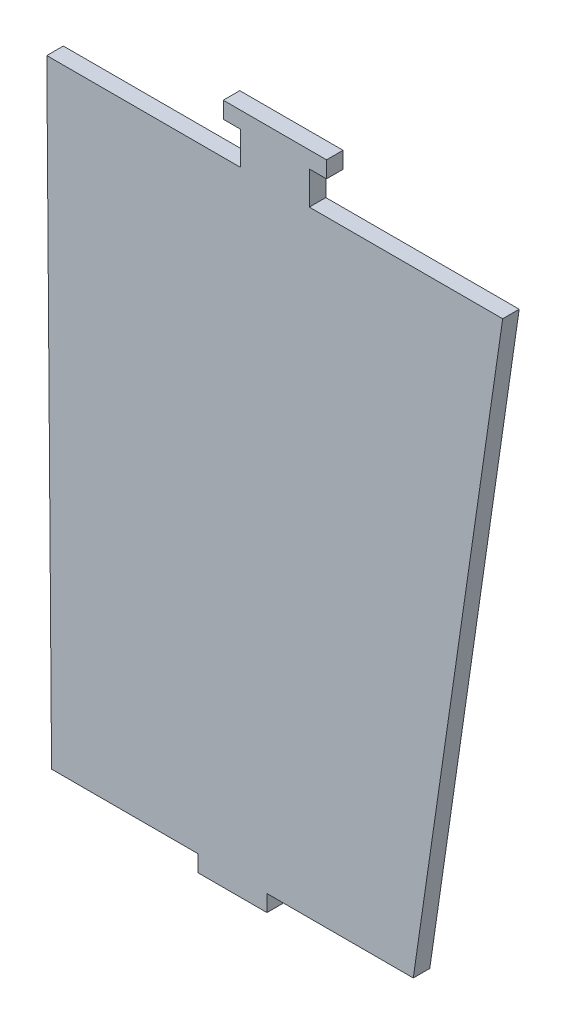
ISO-10303-21;
HEADER;
FILE_DESCRIPTION(('STEP AP214'),'2;1');
FILE_NAME('part.step','',(''),(''),'','','');
FILE_SCHEMA(('AUTOMOTIVE_DESIGN { 1 0 10303 214 1 1 1 1 }'));
ENDSEC;
DATA;
#1=APPLICATION_CONTEXT('core data for automotive mechanical design processes');
#2=APPLICATION_PROTOCOL_DEFINITION('international standard','automotive_design',2000,#1);
#3=PRODUCT_CONTEXT('',#1,'mechanical');
#4=PRODUCT('Part','Part','',(#3));
#5=PRODUCT_RELATED_PRODUCT_CATEGORY('part','',(#4));
#6=PRODUCT_DEFINITION_FORMATION('','',#4);
#7=PRODUCT_DEFINITION_CONTEXT('part definition',#1,'design');
#8=PRODUCT_DEFINITION('design','',#6,#7);
#9=PRODUCT_DEFINITION_SHAPE('','',#8);
#10=(LENGTH_UNIT() NAMED_UNIT(*) SI_UNIT(.MILLI.,.METRE.));
#11=(NAMED_UNIT(*) PLANE_ANGLE_UNIT() SI_UNIT($,.RADIAN.));
#12=(NAMED_UNIT(*) SI_UNIT($,.STERADIAN.) SOLID_ANGLE_UNIT());
#13=UNCERTAINTY_MEASURE_WITH_UNIT(LENGTH_MEASURE(1.E-05),#10,'distance_accuracy_value','');
#14=(GEOMETRIC_REPRESENTATION_CONTEXT(3) GLOBAL_UNCERTAINTY_ASSIGNED_CONTEXT((#13)) GLOBAL_UNIT_ASSIGNED_CONTEXT((#10,
#11,#12)) REPRESENTATION_CONTEXT('',''));
#15=CARTESIAN_POINT('',(0.,0.,0.));
#16=DIRECTION('',(0.,0.,1.));
#17=DIRECTION('',(1.,0.,0.));
#18=AXIS2_PLACEMENT_3D('',#15,#16,#17);
#19=CARTESIAN_POINT('',(-133.13789889878,-58.314338925609,1.524));
#20=DIRECTION('',(0.,1.,0.));
#21=DIRECTION('',(-1.,0.,0.));
#22=AXIS2_PLACEMENT_3D('',#19,#20,#21);
#23=PLANE('',#22);
#24=DIRECTION('',(1.,0.,0.));
#25=VECTOR('',#24,1.);
#26=CARTESIAN_POINT('',(-133.13789889878,-58.314338925609,0.));
#27=LINE('',#26,#25);
#28=CARTESIAN_POINT('',(-146.659325719925,-58.314338925609,0.));
#29=VERTEX_POINT('',#28);
#30=CARTESIAN_POINT('',(-133.13789889878,-58.314338925609,0.));
#31=VERTEX_POINT('',#30);
#32=EDGE_CURVE('E180',#29,#31,#27,.T.);
#33=ORIENTED_EDGE('',*,*,#32,.T.);
#34=DIRECTION('',(0.,0.,-1.));
#35=VECTOR('',#34,1.);
#36=CARTESIAN_POINT('',(-133.13789889878,-58.314338925609,1.524));
#37=LINE('',#36,#35);
#38=CARTESIAN_POINT('',(-133.13789889878,-58.314338925609,1.524));
#39=VERTEX_POINT('',#38);
#40=EDGE_CURVE('E11',#39,#31,#37,.T.);
#41=ORIENTED_EDGE('',*,*,#40,.F.);
#42=DIRECTION('',(1.,0.,0.));
#43=VECTOR('',#42,1.);
#44=CARTESIAN_POINT('',(-133.13789889878,-58.314338925609,1.524));
#45=LINE('',#44,#43);
#46=CARTESIAN_POINT('',(-146.659325719925,-58.314338925609,1.524));
#47=VERTEX_POINT('',#46);
#48=EDGE_CURVE('E210',#47,#39,#45,.T.);
#49=ORIENTED_EDGE('',*,*,#48,.F.);
#50=DIRECTION('',(0.,0.,-1.));
#51=VECTOR('',#50,1.);
#52=CARTESIAN_POINT('',(-146.659325719925,-58.314338925609,1.524));
#53=LINE('',#52,#51);
#54=EDGE_CURVE('E176',#47,#29,#53,.T.);
#55=ORIENTED_EDGE('',*,*,#54,.T.);
#56=EDGE_LOOP('',(#33,#41,#49,#55));
#57=FACE_BOUND('',#56,.T.);
#58=ADVANCED_FACE('F36',(#57),#23,.F.);
#59=CARTESIAN_POINT('',(-133.13789889878,-58.314338925609,1.524));
#60=DIRECTION('',(1.,0.,0.));
#61=DIRECTION('',(0.,0.,-1.));
#62=AXIS2_PLACEMENT_3D('',#59,#60,#61);
#63=PLANE('',#62);
#64=DIRECTION('',(0.,-1.,0.));
#65=VECTOR('',#64,1.);
#66=CARTESIAN_POINT('',(-133.13789889878,-58.314338925609,0.));
#67=LINE('',#66,#65);
#68=CARTESIAN_POINT('',(-133.13789889878,-59.838338925609,0.));
#69=VERTEX_POINT('',#68);
#70=EDGE_CURVE('E183',#31,#69,#67,.T.);
#71=ORIENTED_EDGE('',*,*,#70,.T.);
#72=DIRECTION('',(0.,0.,-1.));
#73=VECTOR('',#72,1.);
#74=CARTESIAN_POINT('',(-133.13789889878,-59.838338925609,1.524));
#75=LINE('',#74,#73);
#76=CARTESIAN_POINT('',(-133.13789889878,-59.838338925609,1.524));
#77=VERTEX_POINT('',#76);
#78=EDGE_CURVE('E44',#77,#69,#75,.T.);
#79=ORIENTED_EDGE('',*,*,#78,.F.);
#80=DIRECTION('',(0.,-1.,0.));
#81=VECTOR('',#80,1.);
#82=CARTESIAN_POINT('',(-133.13789889878,-58.314338925609,1.524));
#83=LINE('',#82,#81);
#84=EDGE_CURVE('E119',#39,#77,#83,.T.);
#85=ORIENTED_EDGE('',*,*,#84,.F.);
#86=ORIENTED_EDGE('',*,*,#40,.T.);
#87=EDGE_LOOP('',(#71,#79,#85,#86));
#88=FACE_BOUND('',#87,.T.);
#89=ADVANCED_FACE('F308',(#88),#63,.F.);
#90=CARTESIAN_POINT('',(-133.13789889878,-59.838338925609,1.524));
#91=DIRECTION('',(0.,1.,0.));
#92=DIRECTION('',(0.,0.,1.));
#93=AXIS2_PLACEMENT_3D('',#90,#91,#92);
#94=PLANE('',#93);
#95=DIRECTION('',(1.,0.,0.));
#96=VECTOR('',#95,1.);
#97=CARTESIAN_POINT('',(-133.13789889878,-59.838338925609,0.));
#98=LINE('',#97,#96);
#99=CARTESIAN_POINT('',(-126.78789889878,-59.838338925609,0.));
#100=VERTEX_POINT('',#99);
#101=EDGE_CURVE('E185',#69,#100,#98,.T.);
#102=ORIENTED_EDGE('',*,*,#101,.T.);
#103=DIRECTION('',(0.,0.,-1.));
#104=VECTOR('',#103,1.);
#105=CARTESIAN_POINT('',(-126.78789889878,-59.838338925609,1.524));
#106=LINE('',#105,#104);
#107=CARTESIAN_POINT('',(-126.78789889878,-59.838338925609,1.524));
#108=VERTEX_POINT('',#107);
#109=EDGE_CURVE('E241',#108,#100,#106,.T.);
#110=ORIENTED_EDGE('',*,*,#109,.F.);
#111=DIRECTION('',(1.,0.,0.));
#112=VECTOR('',#111,1.);
#113=CARTESIAN_POINT('',(-133.13789889878,-59.838338925609,1.524));
#114=LINE('',#113,#112);
#115=EDGE_CURVE('E249',#77,#108,#114,.T.);
#116=ORIENTED_EDGE('',*,*,#115,.F.);
#117=ORIENTED_EDGE('',*,*,#78,.T.);
#118=EDGE_LOOP('',(#102,#110,#116,#117));
#119=FACE_BOUND('',#118,.T.);
#120=ADVANCED_FACE('F247',(#119),#94,.F.);
#121=CARTESIAN_POINT('',(-126.78789889878,-58.314338925609,1.524));
#122=DIRECTION('',(-1.,0.,0.));
#123=DIRECTION('',(0.,0.,1.));
#124=AXIS2_PLACEMENT_3D('',#121,#122,#123);
#125=PLANE('',#124);
#126=DIRECTION('',(0.,1.,0.));
#127=VECTOR('',#126,1.);
#128=CARTESIAN_POINT('',(-126.78789889878,-58.314338925609,0.));
#129=LINE('',#128,#127);
#130=CARTESIAN_POINT('',(-126.78789889878,-58.314338925609,0.));
#131=VERTEX_POINT('',#130);
#132=EDGE_CURVE('E187',#100,#131,#129,.T.);
#133=ORIENTED_EDGE('',*,*,#132,.T.);
#134=DIRECTION('',(0.,0.,-1.));
#135=VECTOR('',#134,1.);
#136=CARTESIAN_POINT('',(-126.78789889878,-58.314338925609,1.524));
#137=LINE('',#136,#135);
#138=CARTESIAN_POINT('',(-126.78789889878,-58.314338925609,1.524));
#139=VERTEX_POINT('',#138);
#140=EDGE_CURVE('E238',#139,#131,#137,.T.);
#141=ORIENTED_EDGE('',*,*,#140,.F.);
#142=DIRECTION('',(0.,1.,0.));
#143=VECTOR('',#142,1.);
#144=CARTESIAN_POINT('',(-126.78789889878,-58.314338925609,1.524));
#145=LINE('',#144,#143);
#146=EDGE_CURVE('E267',#108,#139,#145,.T.);
#147=ORIENTED_EDGE('',*,*,#146,.F.);
#148=ORIENTED_EDGE('',*,*,#109,.T.);
#149=EDGE_LOOP('',(#133,#141,#147,#148));
#150=FACE_BOUND('',#149,.T.);
#151=ADVANCED_FACE('F258',(#150),#125,.F.);
#152=CARTESIAN_POINT('',(-113.2930489299,-58.314338925609,1.524));
#153=DIRECTION('',(0.,1.,0.));
#154=DIRECTION('',(0.,0.,1.));
#155=AXIS2_PLACEMENT_3D('',#152,#153,#154);
#156=PLANE('',#155);
#157=DIRECTION('',(1.,0.,0.));
#158=VECTOR('',#157,1.);
#159=CARTESIAN_POINT('',(-113.2930489299,-58.314338925609,0.));
#160=LINE('',#159,#158);
#161=CARTESIAN_POINT('',(-113.2930489299,-58.314338925609,0.));
#162=VERTEX_POINT('',#161);
#163=EDGE_CURVE('E189',#131,#162,#160,.T.);
#164=ORIENTED_EDGE('',*,*,#163,.T.);
#165=DIRECTION('',(0.,0.,-1.));
#166=VECTOR('',#165,1.);
#167=CARTESIAN_POINT('',(-113.2930489299,-58.314338925609,1.524));
#168=LINE('',#167,#166);
#169=CARTESIAN_POINT('',(-113.2930489299,-58.314338925609,1.524));
#170=VERTEX_POINT('',#169);
#171=EDGE_CURVE('E235',#170,#162,#168,.T.);
#172=ORIENTED_EDGE('',*,*,#171,.F.);
#173=DIRECTION('',(1.,0.,0.));
#174=VECTOR('',#173,1.);
#175=CARTESIAN_POINT('',(-113.2930489299,-58.314338925609,1.524));
#176=LINE('',#175,#174);
#177=EDGE_CURVE('E264',#139,#170,#176,.T.);
#178=ORIENTED_EDGE('',*,*,#177,.F.);
#179=ORIENTED_EDGE('',*,*,#140,.T.);
#180=EDGE_LOOP('',(#164,#172,#178,#179));
#181=FACE_BOUND('',#180,.T.);
#182=ADVANCED_FACE('F262',(#181),#156,.F.);
#183=CARTESIAN_POINT('',(-105.044408822301,-1.524,1.524));
#184=DIRECTION('',(-0.98961564073596,0.143738942568655,0.));
#185=DIRECTION('',(-0.143738942568655,-0.98961564073596,0.));
#186=AXIS2_PLACEMENT_3D('',#183,#184,#185);
#187=PLANE('',#186);
#188=DIRECTION('',(0.143738942568655,0.98961564073596,0.));
#189=VECTOR('',#188,1.);
#190=CARTESIAN_POINT('',(-105.044408822301,-1.524,0.));
#191=LINE('',#190,#189);
#192=CARTESIAN_POINT('',(-105.044408822301,-1.524,0.));
#193=VERTEX_POINT('',#192);
#194=EDGE_CURVE('E191',#162,#193,#191,.T.);
#195=ORIENTED_EDGE('',*,*,#194,.T.);
#196=DIRECTION('',(0.,0.,-1.));
#197=VECTOR('',#196,1.);
#198=CARTESIAN_POINT('',(-105.044408822301,-1.524,1.524));
#199=LINE('',#198,#197);
#200=CARTESIAN_POINT('',(-105.044408822301,-1.524,1.524));
#201=VERTEX_POINT('',#200);
#202=EDGE_CURVE('E232',#201,#193,#199,.T.);
#203=ORIENTED_EDGE('',*,*,#202,.F.);
#204=DIRECTION('',(0.143738942568655,0.98961564073596,0.));
#205=VECTOR('',#204,1.);
#206=CARTESIAN_POINT('',(-105.044408822301,-1.524,1.524));
#207=LINE('',#206,#205);
#208=EDGE_CURVE('E266',#170,#201,#207,.T.);
#209=ORIENTED_EDGE('',*,*,#208,.F.);
#210=ORIENTED_EDGE('',*,*,#171,.T.);
#211=EDGE_LOOP('',(#195,#203,#209,#210));
#212=FACE_BOUND('',#211,.T.);
#213=ADVANCED_FACE('F321',(#212),#187,.F.);
#214=CARTESIAN_POINT('',(-122.883521437337,-1.524,1.524));
#215=DIRECTION('',(0.,-1.,0.));
#216=DIRECTION('',(1.,0.,0.));
#217=AXIS2_PLACEMENT_3D('',#214,#215,#216);
#218=PLANE('',#217);
#219=DIRECTION('',(-1.,0.,0.));
#220=VECTOR('',#219,1.);
#221=CARTESIAN_POINT('',(-122.883521437337,-1.524,0.));
#222=LINE('',#221,#220);
#223=CARTESIAN_POINT('',(-122.883521437337,-1.524,0.));
#224=VERTEX_POINT('',#223);
#225=EDGE_CURVE('E193',#193,#224,#222,.T.);
#226=ORIENTED_EDGE('',*,*,#225,.T.);
#227=DIRECTION('',(0.,0.,-1.));
#228=VECTOR('',#227,1.);
#229=CARTESIAN_POINT('',(-122.883521437337,-1.524,1.524));
#230=LINE('',#229,#228);
#231=CARTESIAN_POINT('',(-122.883521437337,-1.524,1.524));
#232=VERTEX_POINT('',#231);
#233=EDGE_CURVE('E229',#232,#224,#230,.T.);
#234=ORIENTED_EDGE('',*,*,#233,.F.);
#235=DIRECTION('',(-1.,0.,0.));
#236=VECTOR('',#235,1.);
#237=CARTESIAN_POINT('',(-122.883521437337,-1.524,1.524));
#238=LINE('',#237,#236);
#239=EDGE_CURVE('E269',#201,#232,#238,.T.);
#240=ORIENTED_EDGE('',*,*,#239,.F.);
#241=ORIENTED_EDGE('',*,*,#202,.T.);
#242=EDGE_LOOP('',(#226,#234,#240,#241));
#243=FACE_BOUND('',#242,.T.);
#244=ADVANCED_FACE('F324',(#243),#218,.F.);
#245=CARTESIAN_POINT('',(-122.883521437337,-1.524,1.524));
#246=DIRECTION('',(-1.,0.,0.));
#247=DIRECTION('',(0.,0.,1.));
#248=AXIS2_PLACEMENT_3D('',#245,#246,#247);
#249=PLANE('',#248);
#250=DIRECTION('',(0.,1.,0.));
#251=VECTOR('',#250,1.);
#252=CARTESIAN_POINT('',(-122.883521437337,-1.524,0.));
#253=LINE('',#252,#251);
#254=CARTESIAN_POINT('',(-122.883521437337,1.524,0.));
#255=VERTEX_POINT('',#254);
#256=EDGE_CURVE('E195',#224,#255,#253,.T.);
#257=ORIENTED_EDGE('',*,*,#256,.T.);
#258=DIRECTION('',(0.,0.,-1.));
#259=VECTOR('',#258,1.);
#260=CARTESIAN_POINT('',(-122.883521437337,1.524,1.524));
#261=LINE('',#260,#259);
#262=CARTESIAN_POINT('',(-122.883521437337,1.524,1.524));
#263=VERTEX_POINT('',#262);
#264=EDGE_CURVE('E226',#263,#255,#261,.T.);
#265=ORIENTED_EDGE('',*,*,#264,.F.);
#266=DIRECTION('',(0.,1.,0.));
#267=VECTOR('',#266,1.);
#268=CARTESIAN_POINT('',(-122.883521437337,-1.524,1.524));
#269=LINE('',#268,#267);
#270=EDGE_CURVE('E275',#232,#263,#269,.T.);
#271=ORIENTED_EDGE('',*,*,#270,.F.);
#272=ORIENTED_EDGE('',*,*,#233,.T.);
#273=EDGE_LOOP('',(#257,#265,#271,#272));
#274=FACE_BOUND('',#273,.T.);
#275=ADVANCED_FACE('F328',(#274),#249,.F.);
#276=CARTESIAN_POINT('',(-121.296021437337,1.524,1.524));
#277=DIRECTION('',(0.,1.,0.));
#278=DIRECTION('',(-1.,0.,0.));
#279=AXIS2_PLACEMENT_3D('',#276,#277,#278);
#280=PLANE('',#279);
#281=DIRECTION('',(1.,0.,0.));
#282=VECTOR('',#281,1.);
#283=CARTESIAN_POINT('',(-121.296021437337,1.524,0.));
#284=LINE('',#283,#282);
#285=CARTESIAN_POINT('',(-121.296021437337,1.524,0.));
#286=VERTEX_POINT('',#285);
#287=EDGE_CURVE('E197',#255,#286,#284,.T.);
#288=ORIENTED_EDGE('',*,*,#287,.T.);
#289=DIRECTION('',(0.,0.,-1.));
#290=VECTOR('',#289,1.);
#291=CARTESIAN_POINT('',(-121.296021437337,1.524,1.524));
#292=LINE('',#291,#290);
#293=CARTESIAN_POINT('',(-121.296021437337,1.524,1.524));
#294=VERTEX_POINT('',#293);
#295=EDGE_CURVE('E223',#294,#286,#292,.T.);
#296=ORIENTED_EDGE('',*,*,#295,.F.);
#297=DIRECTION('',(1.,0.,0.));
#298=VECTOR('',#297,1.);
#299=CARTESIAN_POINT('',(-121.296021437337,1.524,1.524));
#300=LINE('',#299,#298);
#301=EDGE_CURVE('E277',#263,#294,#300,.T.);
#302=ORIENTED_EDGE('',*,*,#301,.F.);
#303=ORIENTED_EDGE('',*,*,#264,.T.);
#304=EDGE_LOOP('',(#288,#296,#302,#303));
#305=FACE_BOUND('',#304,.T.);
#306=ADVANCED_FACE('F332',(#305),#280,.F.);
#307=CARTESIAN_POINT('',(-121.296021437337,1.524,1.524));
#308=DIRECTION('',(-1.,0.,0.));
#309=DIRECTION('',(0.,0.,1.));
#310=AXIS2_PLACEMENT_3D('',#307,#308,#309);
#311=PLANE('',#310);
#312=DIRECTION('',(0.,1.,0.));
#313=VECTOR('',#312,1.);
#314=CARTESIAN_POINT('',(-121.296021437337,1.524,0.));
#315=LINE('',#314,#313);
#316=CARTESIAN_POINT('',(-121.296021437337,3.048,0.));
#317=VERTEX_POINT('',#316);
#318=EDGE_CURVE('E199',#286,#317,#315,.T.);
#319=ORIENTED_EDGE('',*,*,#318,.T.);
#320=DIRECTION('',(0.,0.,-1.));
#321=VECTOR('',#320,1.);
#322=CARTESIAN_POINT('',(-121.296021437337,3.048,1.524));
#323=LINE('',#322,#321);
#324=CARTESIAN_POINT('',(-121.296021437337,3.048,1.524));
#325=VERTEX_POINT('',#324);
#326=EDGE_CURVE('E220',#325,#317,#323,.T.);
#327=ORIENTED_EDGE('',*,*,#326,.F.);
#328=DIRECTION('',(0.,1.,0.));
#329=VECTOR('',#328,1.);
#330=CARTESIAN_POINT('',(-121.296021437337,1.524,1.524));
#331=LINE('',#330,#329);
#332=EDGE_CURVE('E279',#294,#325,#331,.T.);
#333=ORIENTED_EDGE('',*,*,#332,.F.);
#334=ORIENTED_EDGE('',*,*,#295,.T.);
#335=EDGE_LOOP('',(#319,#327,#333,#334));
#336=FACE_BOUND('',#335,.T.);
#337=ADVANCED_FACE('F336',(#336),#311,.F.);
#338=CARTESIAN_POINT('',(-121.296021437337,3.048,1.524));
#339=DIRECTION('',(0.,-1.,0.));
#340=DIRECTION('',(0.,0.,-1.));
#341=AXIS2_PLACEMENT_3D('',#338,#339,#340);
#342=PLANE('',#341);
#343=DIRECTION('',(-1.,0.,0.));
#344=VECTOR('',#343,1.);
#345=CARTESIAN_POINT('',(-121.296021437337,3.048,0.));
#346=LINE('',#345,#344);
#347=CARTESIAN_POINT('',(-130.821021437337,3.048,0.));
#348=VERTEX_POINT('',#347);
#349=EDGE_CURVE('E201',#317,#348,#346,.T.);
#350=ORIENTED_EDGE('',*,*,#349,.T.);
#351=DIRECTION('',(0.,0.,-1.));
#352=VECTOR('',#351,1.);
#353=CARTESIAN_POINT('',(-130.821021437337,3.048,1.524));
#354=LINE('',#353,#352);
#355=CARTESIAN_POINT('',(-130.821021437337,3.048,1.524));
#356=VERTEX_POINT('',#355);
#357=EDGE_CURVE('E217',#356,#348,#354,.T.);
#358=ORIENTED_EDGE('',*,*,#357,.F.);
#359=DIRECTION('',(-1.,0.,0.));
#360=VECTOR('',#359,1.);
#361=CARTESIAN_POINT('',(-121.296021437337,3.048,1.524));
#362=LINE('',#361,#360);
#363=EDGE_CURVE('E281',#325,#356,#362,.T.);
#364=ORIENTED_EDGE('',*,*,#363,.F.);
#365=ORIENTED_EDGE('',*,*,#326,.T.);
#366=EDGE_LOOP('',(#350,#358,#364,#365));
#367=FACE_BOUND('',#366,.T.);
#368=ADVANCED_FACE('F340',(#367),#342,.F.);
#369=CARTESIAN_POINT('',(-130.821021437337,1.524,1.524));
#370=DIRECTION('',(1.,0.,0.));
#371=DIRECTION('',(0.,0.,-1.));
#372=AXIS2_PLACEMENT_3D('',#369,#370,#371);
#373=PLANE('',#372);
#374=DIRECTION('',(0.,-1.,0.));
#375=VECTOR('',#374,1.);
#376=CARTESIAN_POINT('',(-130.821021437337,1.524,0.));
#377=LINE('',#376,#375);
#378=CARTESIAN_POINT('',(-130.821021437337,1.524,0.));
#379=VERTEX_POINT('',#378);
#380=EDGE_CURVE('E203',#348,#379,#377,.T.);
#381=ORIENTED_EDGE('',*,*,#380,.T.);
#382=DIRECTION('',(0.,0.,-1.));
#383=VECTOR('',#382,1.);
#384=CARTESIAN_POINT('',(-130.821021437337,1.524,1.524));
#385=LINE('',#384,#383);
#386=CARTESIAN_POINT('',(-130.821021437337,1.524,1.524));
#387=VERTEX_POINT('',#386);
#388=EDGE_CURVE('E214',#387,#379,#385,.T.);
#389=ORIENTED_EDGE('',*,*,#388,.F.);
#390=DIRECTION('',(0.,-1.,0.));
#391=VECTOR('',#390,1.);
#392=CARTESIAN_POINT('',(-130.821021437337,1.524,1.524));
#393=LINE('',#392,#391);
#394=EDGE_CURVE('E283',#356,#387,#393,.T.);
#395=ORIENTED_EDGE('',*,*,#394,.F.);
#396=ORIENTED_EDGE('',*,*,#357,.T.);
#397=EDGE_LOOP('',(#381,#389,#395,#396));
#398=FACE_BOUND('',#397,.T.);
#399=ADVANCED_FACE('F289',(#398),#373,.F.);
#400=CARTESIAN_POINT('',(-129.233521437337,1.524,1.524));
#401=DIRECTION('',(0.,1.,0.));
#402=DIRECTION('',(-1.,0.,0.));
#403=AXIS2_PLACEMENT_3D('',#400,#401,#402);
#404=PLANE('',#403);
#405=DIRECTION('',(1.,0.,0.));
#406=VECTOR('',#405,1.);
#407=CARTESIAN_POINT('',(-129.233521437337,1.524,0.));
#408=LINE('',#407,#406);
#409=CARTESIAN_POINT('',(-129.233521437337,1.524,0.));
#410=VERTEX_POINT('',#409);
#411=EDGE_CURVE('E205',#379,#410,#408,.T.);
#412=ORIENTED_EDGE('',*,*,#411,.T.);
#413=DIRECTION('',(0.,0.,-1.));
#414=VECTOR('',#413,1.);
#415=CARTESIAN_POINT('',(-129.233521437337,1.524,1.524));
#416=LINE('',#415,#414);
#417=CARTESIAN_POINT('',(-129.233521437337,1.524,1.524));
#418=VERTEX_POINT('',#417);
#419=EDGE_CURVE('E171',#418,#410,#416,.T.);
#420=ORIENTED_EDGE('',*,*,#419,.F.);
#421=DIRECTION('',(1.,0.,0.));
#422=VECTOR('',#421,1.);
#423=CARTESIAN_POINT('',(-129.233521437337,1.524,1.524));
#424=LINE('',#423,#422);
#425=EDGE_CURVE('E162',#387,#418,#424,.T.);
#426=ORIENTED_EDGE('',*,*,#425,.F.);
#427=ORIENTED_EDGE('',*,*,#388,.T.);
#428=EDGE_LOOP('',(#412,#420,#426,#427));
#429=FACE_BOUND('',#428,.T.);
#430=ADVANCED_FACE('F293',(#429),#404,.F.);
#431=CARTESIAN_POINT('',(-129.233521437337,-1.524,1.524));
#432=DIRECTION('',(1.,0.,0.));
#433=DIRECTION('',(0.,0.,-1.));
#434=AXIS2_PLACEMENT_3D('',#431,#432,#433);
#435=PLANE('',#434);
#436=DIRECTION('',(0.,-1.,0.));
#437=VECTOR('',#436,1.);
#438=CARTESIAN_POINT('',(-129.233521437337,-1.524,0.));
#439=LINE('',#438,#437);
#440=CARTESIAN_POINT('',(-129.233521437337,-1.524,0.));
#441=VERTEX_POINT('',#440);
#442=EDGE_CURVE('E170',#410,#441,#439,.T.);
#443=ORIENTED_EDGE('',*,*,#442,.T.);
#444=DIRECTION('',(0.,0.,-1.));
#445=VECTOR('',#444,1.);
#446=CARTESIAN_POINT('',(-129.233521437337,-1.524,1.524));
#447=LINE('',#446,#445);
#448=CARTESIAN_POINT('',(-129.233521437337,-1.524,1.524));
#449=VERTEX_POINT('',#448);
#450=EDGE_CURVE('E167',#449,#441,#447,.T.);
#451=ORIENTED_EDGE('',*,*,#450,.F.);
#452=DIRECTION('',(0.,-1.,0.));
#453=VECTOR('',#452,1.);
#454=CARTESIAN_POINT('',(-129.233521437337,-1.524,1.524));
#455=LINE('',#454,#453);
#456=EDGE_CURVE('E156',#418,#449,#455,.T.);
#457=ORIENTED_EDGE('',*,*,#456,.F.);
#458=ORIENTED_EDGE('',*,*,#419,.T.);
#459=EDGE_LOOP('',(#443,#451,#457,#458));
#460=FACE_BOUND('',#459,.T.);
#461=ADVANCED_FACE('F168',(#460),#435,.F.);
#462=CARTESIAN_POINT('',(-147.099210904638,-1.524,1.524));
#463=DIRECTION('',(0.,-1.,0.));
#464=DIRECTION('',(1.,0.,0.));
#465=AXIS2_PLACEMENT_3D('',#462,#463,#464);
#466=PLANE('',#465);
#467=DIRECTION('',(-1.,0.,0.));
#468=VECTOR('',#467,1.);
#469=CARTESIAN_POINT('',(-147.099210904638,-1.524,0.));
#470=LINE('',#469,#468);
#471=CARTESIAN_POINT('',(-147.099210904638,-1.524,0.));
#472=VERTEX_POINT('',#471);
#473=EDGE_CURVE('E105',#441,#472,#470,.T.);
#474=ORIENTED_EDGE('',*,*,#473,.T.);
#475=DIRECTION('',(0.,0.,-1.));
#476=VECTOR('',#475,1.);
#477=CARTESIAN_POINT('',(-147.099210904638,-1.524,1.524));
#478=LINE('',#477,#476);
#479=CARTESIAN_POINT('',(-147.099210904638,-1.524,1.524));
#480=VERTEX_POINT('',#479);
#481=EDGE_CURVE('E172',#480,#472,#478,.T.);
#482=ORIENTED_EDGE('',*,*,#481,.F.);
#483=DIRECTION('',(-1.,0.,0.));
#484=VECTOR('',#483,1.);
#485=CARTESIAN_POINT('',(-147.099210904638,-1.524,1.524));
#486=LINE('',#485,#484);
#487=EDGE_CURVE('E160',#449,#480,#486,.T.);
#488=ORIENTED_EDGE('',*,*,#487,.F.);
#489=ORIENTED_EDGE('',*,*,#450,.T.);
#490=EDGE_LOOP('',(#474,#482,#488,#489));
#491=FACE_BOUND('',#490,.T.);
#492=ADVANCED_FACE('F174',(#491),#466,.F.);
#493=CARTESIAN_POINT('',(-146.659325719925,-58.314338925609,1.524));
#494=DIRECTION('',(0.999970002835002,0.00774554259978691,0.));
#495=DIRECTION('',(-0.00774554259978691,0.999970002835003,0.));
#496=AXIS2_PLACEMENT_3D('',#493,#494,#495);
#497=PLANE('',#496);
#498=DIRECTION('',(0.00774554259978691,-0.999970002835002,0.));
#499=VECTOR('',#498,1.);
#500=CARTESIAN_POINT('',(-146.659325719925,-58.314338925609,0.));
#501=LINE('',#500,#499);
#502=EDGE_CURVE('E111',#472,#29,#501,.T.);
#503=ORIENTED_EDGE('',*,*,#502,.T.);
#504=ORIENTED_EDGE('',*,*,#54,.F.);
#505=DIRECTION('',(0.00774554259978691,-0.999970002835002,0.));
#506=VECTOR('',#505,1.);
#507=CARTESIAN_POINT('',(-146.659325719925,-58.314338925609,1.524));
#508=LINE('',#507,#506);
#509=EDGE_CURVE('E52',#480,#47,#508,.T.);
#510=ORIENTED_EDGE('',*,*,#509,.F.);
#511=ORIENTED_EDGE('',*,*,#481,.T.);
#512=EDGE_LOOP('',(#503,#504,#510,#511));
#513=FACE_BOUND('',#512,.T.);
#514=ADVANCED_FACE('F297',(#513),#497,.F.);
#515=CARTESIAN_POINT('',(0.,0.,1.524));
#516=DIRECTION('',(0.,0.,-1.));
#517=DIRECTION('',(-1.,0.,0.));
#518=AXIS2_PLACEMENT_3D('',#515,#516,#517);
#519=PLANE('',#518);
#520=ORIENTED_EDGE('',*,*,#48,.T.);
#521=ORIENTED_EDGE('',*,*,#84,.T.);
#522=ORIENTED_EDGE('',*,*,#115,.T.);
#523=ORIENTED_EDGE('',*,*,#146,.T.);
#524=ORIENTED_EDGE('',*,*,#177,.T.);
#525=ORIENTED_EDGE('',*,*,#208,.T.);
#526=ORIENTED_EDGE('',*,*,#239,.T.);
#527=ORIENTED_EDGE('',*,*,#270,.T.);
#528=ORIENTED_EDGE('',*,*,#301,.T.);
#529=ORIENTED_EDGE('',*,*,#332,.T.);
#530=ORIENTED_EDGE('',*,*,#363,.T.);
#531=ORIENTED_EDGE('',*,*,#394,.T.);
#532=ORIENTED_EDGE('',*,*,#425,.T.);
#533=ORIENTED_EDGE('',*,*,#456,.T.);
#534=ORIENTED_EDGE('',*,*,#487,.T.);
#535=ORIENTED_EDGE('',*,*,#509,.T.);
#536=EDGE_LOOP('',(#520,#521,#522,#523,#524,#525,#526,#527,#528,#529,#530,#531,#532,#533,#534,#535));
#537=FACE_BOUND('',#536,.T.);
#538=ADVANCED_FACE('F158',(#537),#519,.F.);
#539=CARTESIAN_POINT('',(0.,0.,0.));
#540=DIRECTION('',(0.,0.,-1.));
#541=DIRECTION('',(-1.,0.,0.));
#542=AXIS2_PLACEMENT_3D('',#539,#540,#541);
#543=PLANE('',#542);
#544=ORIENTED_EDGE('',*,*,#32,.F.);
#545=ORIENTED_EDGE('',*,*,#502,.F.);
#546=ORIENTED_EDGE('',*,*,#473,.F.);
#547=ORIENTED_EDGE('',*,*,#442,.F.);
#548=ORIENTED_EDGE('',*,*,#411,.F.);
#549=ORIENTED_EDGE('',*,*,#380,.F.);
#550=ORIENTED_EDGE('',*,*,#349,.F.);
#551=ORIENTED_EDGE('',*,*,#318,.F.);
#552=ORIENTED_EDGE('',*,*,#287,.F.);
#553=ORIENTED_EDGE('',*,*,#256,.F.);
#554=ORIENTED_EDGE('',*,*,#225,.F.);
#555=ORIENTED_EDGE('',*,*,#194,.F.);
#556=ORIENTED_EDGE('',*,*,#163,.F.);
#557=ORIENTED_EDGE('',*,*,#132,.F.);
#558=ORIENTED_EDGE('',*,*,#101,.F.);
#559=ORIENTED_EDGE('',*,*,#70,.F.);
#560=EDGE_LOOP('',(#544,#545,#546,#547,#548,#549,#550,#551,#552,#553,#554,#555,#556,#557,#558,#559));
#561=FACE_BOUND('',#560,.T.);
#562=ADVANCED_FACE('F253',(#561),#543,.T.);
#563=CLOSED_SHELL('',(#58,#89,#120,#151,#182,#213,#244,#275,#306,#337,#368,#399,#430,#461,#492,
#514,#538,#562));
#564=MANIFOLD_SOLID_BREP('B2',#563);
#565=ADVANCED_BREP_SHAPE_REPRESENTATION('',(#18,#564),#14);
#566=SHAPE_DEFINITION_REPRESENTATION(#9,#565);
ENDSEC;
END-ISO-10303-21;
